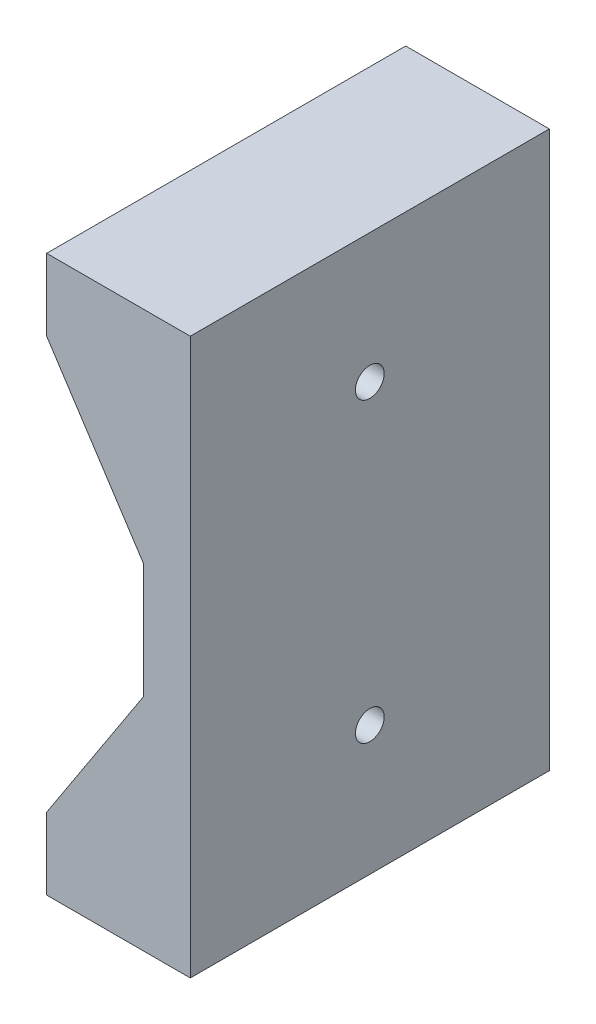
ISO-10303-21;
HEADER;
FILE_DESCRIPTION(('STEP AP214'),'2;1');
FILE_NAME('part.step','',(''),(''),'','','');
FILE_SCHEMA(('AUTOMOTIVE_DESIGN { 1 0 10303 214 1 1 1 1 }'));
ENDSEC;
DATA;
#1=APPLICATION_CONTEXT('core data for automotive mechanical design processes');
#2=APPLICATION_PROTOCOL_DEFINITION('international standard','automotive_design',2000,#1);
#3=PRODUCT_CONTEXT('',#1,'mechanical');
#4=PRODUCT('Part','Part','',(#3));
#5=PRODUCT_RELATED_PRODUCT_CATEGORY('part','',(#4));
#6=PRODUCT_DEFINITION_FORMATION('','',#4);
#7=PRODUCT_DEFINITION_CONTEXT('part definition',#1,'design');
#8=PRODUCT_DEFINITION('design','',#6,#7);
#9=PRODUCT_DEFINITION_SHAPE('','',#8);
#10=(LENGTH_UNIT() NAMED_UNIT(*) SI_UNIT(.MILLI.,.METRE.));
#11=(NAMED_UNIT(*) PLANE_ANGLE_UNIT() SI_UNIT($,.RADIAN.));
#12=(NAMED_UNIT(*) SI_UNIT($,.STERADIAN.) SOLID_ANGLE_UNIT());
#13=UNCERTAINTY_MEASURE_WITH_UNIT(LENGTH_MEASURE(1.E-05),#10,'distance_accuracy_value','');
#14=(GEOMETRIC_REPRESENTATION_CONTEXT(3) GLOBAL_UNCERTAINTY_ASSIGNED_CONTEXT((#13)) GLOBAL_UNIT_ASSIGNED_CONTEXT((#10,
#11,#12)) REPRESENTATION_CONTEXT('',''));
#15=CARTESIAN_POINT('',(0.,0.,0.));
#16=DIRECTION('',(0.,0.,1.));
#17=DIRECTION('',(1.,0.,0.));
#18=AXIS2_PLACEMENT_3D('',#15,#16,#17);
#19=CARTESIAN_POINT('',(8.5,0.,0.));
#20=DIRECTION('',(1.,0.,0.));
#21=DIRECTION('',(0.,0.,-1.));
#22=AXIS2_PLACEMENT_3D('',#19,#20,#21);
#23=PLANE('',#22);
#24=DIRECTION('',(0.,0.,-1.));
#25=VECTOR('',#24,1.);
#26=CARTESIAN_POINT('',(8.5,8.,0.));
#27=LINE('',#26,#25);
#28=CARTESIAN_POINT('',(8.5,8.,80.1107059078754));
#29=VERTEX_POINT('',#28);
#30=CARTESIAN_POINT('',(8.5,8.,70.1107059078754));
#31=VERTEX_POINT('',#30);
#32=EDGE_CURVE('E376',#29,#31,#27,.T.);
#33=ORIENTED_EDGE('',*,*,#32,.T.);
#34=DIRECTION('',(0.,1.,0.));
#35=VECTOR('',#34,1.);
#36=CARTESIAN_POINT('',(8.5,8.,70.1107059078754));
#37=LINE('',#36,#35);
#38=CARTESIAN_POINT('',(8.5,-8.,70.1107059078754));
#39=VERTEX_POINT('',#38);
#40=EDGE_CURVE('E194',#39,#31,#37,.T.);
#41=ORIENTED_EDGE('',*,*,#40,.F.);
#42=CARTESIAN_POINT('',(8.5,-8.,70.1107059078754));
#43=DIRECTION('',(0.,0.,1.));
#44=VECTOR('',#43,1.);
#45=LINE('',#42,#44);
#46=CARTESIAN_POINT('',(8.5,-8.,80.1107059078754));
#47=VERTEX_POINT('',#46);
#48=EDGE_CURVE('E186',#39,#47,#45,.T.);
#49=ORIENTED_EDGE('',*,*,#48,.T.);
#50=DIRECTION('',(0.,1.,0.));
#51=VECTOR('',#50,1.);
#52=CARTESIAN_POINT('',(8.5,8.,80.1107059078754));
#53=LINE('',#52,#51);
#54=EDGE_CURVE('E176',#47,#29,#53,.T.);
#55=ORIENTED_EDGE('',*,*,#54,.T.);
#56=EDGE_LOOP('',(#33,#41,#49,#55));
#57=FACE_BOUND('',#56,.T.);
#58=ADVANCED_FACE('F71',(#57),#23,.F.);
#59=CARTESIAN_POINT('',(12.,0.,0.));
#60=DIRECTION('',(1.,0.,0.));
#61=DIRECTION('',(0.,0.,-1.));
#62=AXIS2_PLACEMENT_3D('',#59,#60,#61);
#63=PLANE('',#62);
#64=CARTESIAN_POINT('',(12.,-20.7,55.1107059078754));
#65=DIRECTION('',(1.,0.,0.));
#66=DIRECTION('',(0.,0.,1.));
#67=AXIS2_PLACEMENT_3D('',#64,#65,#66);
#68=CIRCLE('',#67,2.);
#69=CARTESIAN_POINT('',(12.,-20.7,57.1107059078754));
#70=VERTEX_POINT('',#69);
#71=EDGE_CURVE('E322',#70,#70,#68,.T.);
#72=ORIENTED_EDGE('',*,*,#71,.T.);
#73=EDGE_LOOP('',(#72));
#74=FACE_BOUND('',#73,.T.);
#75=CARTESIAN_POINT('',(12.,-20.7,55.1107059078754));
#76=DIRECTION('',(-1.,0.,0.));
#77=DIRECTION('',(0.,0.,-1.));
#78=AXIS2_PLACEMENT_3D('',#75,#76,#77);
#79=CIRCLE('',#78,15.);
#80=CARTESIAN_POINT('',(12.,-28.7,42.4221283674258));
#81=VERTEX_POINT('',#80);
#82=CARTESIAN_POINT('',(12.,-28.7,67.7992834483249));
#83=VERTEX_POINT('',#82);
#84=EDGE_CURVE('E148',#81,#83,#79,.T.);
#85=ORIENTED_EDGE('',*,*,#84,.T.);
#86=DIRECTION('',(0.,0.993823396653931,0.110973223181287));
#87=VECTOR('',#86,1.);
#88=CARTESIAN_POINT('',(12.,-28.7,67.7992834483249));
#89=LINE('',#88,#87);
#90=CARTESIAN_POINT('',(12.,-8.,70.1107059078754));
#91=VERTEX_POINT('',#90);
#92=EDGE_CURVE('E134',#83,#91,#89,.T.);
#93=ORIENTED_EDGE('',*,*,#92,.T.);
#94=DIRECTION('',(0.,1.,0.));
#95=VECTOR('',#94,1.);
#96=CARTESIAN_POINT('',(12.,8.,70.1107059078754));
#97=LINE('',#96,#95);
#98=CARTESIAN_POINT('',(12.,8.,70.1107059078754));
#99=VERTEX_POINT('',#98);
#100=EDGE_CURVE('E388',#91,#99,#97,.T.);
#101=ORIENTED_EDGE('',*,*,#100,.T.);
#102=DIRECTION('',(0.,0.993823396653931,-0.110973223181287));
#103=VECTOR('',#102,1.);
#104=CARTESIAN_POINT('',(12.,8.,70.1107059078754));
#105=LINE('',#104,#103);
#106=CARTESIAN_POINT('',(12.,28.7,67.7992834483249));
#107=VERTEX_POINT('',#106);
#108=EDGE_CURVE('E914',#99,#107,#105,.T.);
#109=ORIENTED_EDGE('',*,*,#108,.T.);
#110=CARTESIAN_POINT('',(12.,20.7,55.1107059078754));
#111=DIRECTION('',(1.,0.,0.));
#112=DIRECTION('',(0.,0.,-1.));
#113=AXIS2_PLACEMENT_3D('',#110,#111,#112);
#114=CIRCLE('',#113,15.);
#115=CARTESIAN_POINT('',(12.,28.7,42.4221283674258));
#116=VERTEX_POINT('',#115);
#117=EDGE_CURVE('E314',#116,#107,#114,.T.);
#118=ORIENTED_EDGE('',*,*,#117,.F.);
#119=DIRECTION('',(0.,-0.993823396653931,-0.110973223181286));
#120=VECTOR('',#119,1.);
#121=CARTESIAN_POINT('',(12.,28.7,42.4221283674258));
#122=LINE('',#121,#120);
#123=CARTESIAN_POINT('',(12.,8.,40.1107059078754));
#124=VERTEX_POINT('',#123);
#125=EDGE_CURVE('E945',#116,#124,#122,.T.);
#126=ORIENTED_EDGE('',*,*,#125,.T.);
#127=DIRECTION('',(0.,-1.,0.));
#128=VECTOR('',#127,1.);
#129=CARTESIAN_POINT('',(12.,8.,40.1107059078754));
#130=LINE('',#129,#128);
#131=CARTESIAN_POINT('',(12.,-8.,40.1107059078754));
#132=VERTEX_POINT('',#131);
#133=EDGE_CURVE('E280',#124,#132,#130,.T.);
#134=ORIENTED_EDGE('',*,*,#133,.T.);
#135=DIRECTION('',(0.,-0.993823396653931,0.110973223181286));
#136=VECTOR('',#135,1.);
#137=CARTESIAN_POINT('',(12.,-8.,40.1107059078754));
#138=LINE('',#137,#136);
#139=EDGE_CURVE('E158',#132,#81,#138,.T.);
#140=ORIENTED_EDGE('',*,*,#139,.T.);
#141=EDGE_LOOP('',(#85,#93,#101,#109,#118,#126,#134,#140));
#142=FACE_BOUND('',#141,.T.);
#143=CARTESIAN_POINT('',(12.,20.7,55.1107059078754));
#144=DIRECTION('',(1.,0.,0.));
#145=DIRECTION('',(0.,0.,-1.));
#146=AXIS2_PLACEMENT_3D('',#143,#144,#145);
#147=CIRCLE('',#146,2.);
#148=CARTESIAN_POINT('',(12.,20.7,53.1107059078754));
#149=VERTEX_POINT('',#148);
#150=EDGE_CURVE('E333',#149,#149,#147,.T.);
#151=ORIENTED_EDGE('',*,*,#150,.T.);
#152=EDGE_LOOP('',(#151));
#153=FACE_BOUND('',#152,.T.);
#154=ADVANCED_FACE('F154',(#74,#142,#153),#63,.F.);
#155=CARTESIAN_POINT('',(12.,38.7,80.1107059078754));
#156=DIRECTION('',(0.,0.,1.));
#157=DIRECTION('',(0.,-1.,0.));
#158=AXIS2_PLACEMENT_3D('',#155,#156,#157);
#159=PLANE('',#158);
#160=DIRECTION('',(0.,-1.,0.));
#161=VECTOR('',#160,1.);
#162=CARTESIAN_POINT('',(15.,38.7,80.1107059078754));
#163=LINE('',#162,#161);
#164=CARTESIAN_POINT('',(15.,38.7,80.1107059078754));
#165=VERTEX_POINT('',#164);
#166=CARTESIAN_POINT('',(15.,-38.7,80.1107059078753));
#167=VERTEX_POINT('',#166);
#168=EDGE_CURVE('E332',#165,#167,#163,.T.);
#169=ORIENTED_EDGE('',*,*,#168,.F.);
#170=DIRECTION('',(1.,0.,0.));
#171=VECTOR('',#170,1.);
#172=CARTESIAN_POINT('',(12.,38.7,80.1107059078754));
#173=LINE('',#172,#171);
#174=CARTESIAN_POINT('',(-5.,38.7,80.1107059078754));
#175=VERTEX_POINT('',#174);
#176=EDGE_CURVE('E346',#175,#165,#173,.T.);
#177=ORIENTED_EDGE('',*,*,#176,.F.);
#178=DIRECTION('',(0.,1.,0.));
#179=VECTOR('',#178,1.);
#180=CARTESIAN_POINT('',(-5.,38.7,80.1107059078754));
#181=LINE('',#180,#179);
#182=CARTESIAN_POINT('',(-5.,28.7,80.1107059078754));
#183=VERTEX_POINT('',#182);
#184=EDGE_CURVE('E325',#183,#175,#181,.T.);
#185=ORIENTED_EDGE('',*,*,#184,.F.);
#186=DIRECTION('',(-0.546267780546922,0.837610596838614,0.));
#187=VECTOR('',#186,1.);
#188=CARTESIAN_POINT('',(8.5,8.,80.1107059078754));
#189=LINE('',#188,#187);
#190=EDGE_CURVE('E907',#29,#183,#189,.T.);
#191=ORIENTED_EDGE('',*,*,#190,.F.);
#192=ORIENTED_EDGE('',*,*,#54,.F.);
#193=DIRECTION('',(0.546267780546922,0.837610596838614,0.));
#194=VECTOR('',#193,1.);
#195=CARTESIAN_POINT('',(-5.,-28.7,80.1107059078754));
#196=LINE('',#195,#194);
#197=CARTESIAN_POINT('',(-5.,-28.7,80.1107059078754));
#198=VERTEX_POINT('',#197);
#199=EDGE_CURVE('E902',#198,#47,#196,.T.);
#200=ORIENTED_EDGE('',*,*,#199,.F.);
#201=DIRECTION('',(0.,-1.,0.));
#202=VECTOR('',#201,1.);
#203=CARTESIAN_POINT('',(-5.,-38.7,80.1107059078754));
#204=LINE('',#203,#202);
#205=CARTESIAN_POINT('',(-5.,-38.7,80.1107059078754));
#206=VERTEX_POINT('',#205);
#207=EDGE_CURVE('E173',#198,#206,#204,.T.);
#208=ORIENTED_EDGE('',*,*,#207,.T.);
#209=DIRECTION('',(1.,0.,0.));
#210=VECTOR('',#209,1.);
#211=CARTESIAN_POINT('',(12.,-38.7,80.1107059078753));
#212=LINE('',#211,#210);
#213=EDGE_CURVE('E349',#206,#167,#212,.T.);
#214=ORIENTED_EDGE('',*,*,#213,.T.);
#215=EDGE_LOOP('',(#169,#177,#185,#191,#192,#200,#208,#214));
#216=FACE_BOUND('',#215,.T.);
#217=ADVANCED_FACE('F74',(#216),#159,.T.);
#218=CARTESIAN_POINT('',(12.,38.7,80.1107059078754));
#219=DIRECTION('',(0.,1.,0.));
#220=DIRECTION('',(0.,0.,1.));
#221=AXIS2_PLACEMENT_3D('',#218,#219,#220);
#222=PLANE('',#221);
#223=DIRECTION('',(0.,0.,1.));
#224=VECTOR('',#223,1.);
#225=CARTESIAN_POINT('',(15.,38.7,80.1107059078754));
#226=LINE('',#225,#224);
#227=CARTESIAN_POINT('',(15.,38.7,30.1107059078754));
#228=VERTEX_POINT('',#227);
#229=EDGE_CURVE('E344',#228,#165,#226,.T.);
#230=ORIENTED_EDGE('',*,*,#229,.F.);
#231=DIRECTION('',(1.,0.,0.));
#232=VECTOR('',#231,1.);
#233=CARTESIAN_POINT('',(12.,38.7,30.1107059078754));
#234=LINE('',#233,#232);
#235=CARTESIAN_POINT('',(-5.,38.7,30.1107059078754));
#236=VERTEX_POINT('',#235);
#237=EDGE_CURVE('E351',#236,#228,#234,.T.);
#238=ORIENTED_EDGE('',*,*,#237,.F.);
#239=DIRECTION('',(0.,0.,-1.));
#240=VECTOR('',#239,1.);
#241=CARTESIAN_POINT('',(-5.,38.7,30.1107059078754));
#242=LINE('',#241,#240);
#243=EDGE_CURVE('E319',#175,#236,#242,.T.);
#244=ORIENTED_EDGE('',*,*,#243,.F.);
#245=ORIENTED_EDGE('',*,*,#176,.T.);
#246=EDGE_LOOP('',(#230,#238,#244,#245));
#247=FACE_BOUND('',#246,.T.);
#248=ADVANCED_FACE('F442',(#247),#222,.T.);
#249=CARTESIAN_POINT('',(12.,38.7,30.1107059078754));
#250=DIRECTION('',(0.,0.,-1.));
#251=DIRECTION('',(0.,1.,0.));
#252=AXIS2_PLACEMENT_3D('',#249,#250,#251);
#253=PLANE('',#252);
#254=DIRECTION('',(0.,1.,0.));
#255=VECTOR('',#254,1.);
#256=CARTESIAN_POINT('',(15.,38.7,30.1107059078754));
#257=LINE('',#256,#255);
#258=CARTESIAN_POINT('',(15.,-38.7,30.1107059078754));
#259=VERTEX_POINT('',#258);
#260=EDGE_CURVE('E345',#259,#228,#257,.T.);
#261=ORIENTED_EDGE('',*,*,#260,.F.);
#262=DIRECTION('',(1.,0.,0.));
#263=VECTOR('',#262,1.);
#264=CARTESIAN_POINT('',(12.,-38.7,30.1107059078754));
#265=LINE('',#264,#263);
#266=CARTESIAN_POINT('',(-5.,-38.7,30.1107059078754));
#267=VERTEX_POINT('',#266);
#268=EDGE_CURVE('E358',#267,#259,#265,.T.);
#269=ORIENTED_EDGE('',*,*,#268,.F.);
#270=DIRECTION('',(0.,1.,0.));
#271=VECTOR('',#270,1.);
#272=CARTESIAN_POINT('',(-5.,-38.7,30.1107059078754));
#273=LINE('',#272,#271);
#274=CARTESIAN_POINT('',(-5.,-28.7,30.1107059078754));
#275=VERTEX_POINT('',#274);
#276=EDGE_CURVE('E160',#267,#275,#273,.T.);
#277=ORIENTED_EDGE('',*,*,#276,.T.);
#278=DIRECTION('',(-0.546267780546922,-0.837610596838614,0.));
#279=VECTOR('',#278,1.);
#280=CARTESIAN_POINT('',(8.5,-8.,30.1107059078754));
#281=LINE('',#280,#279);
#282=CARTESIAN_POINT('',(8.5,-8.,30.1107059078754));
#283=VERTEX_POINT('',#282);
#284=EDGE_CURVE('E898',#283,#275,#281,.T.);
#285=ORIENTED_EDGE('',*,*,#284,.F.);
#286=DIRECTION('',(0.,-1.,0.));
#287=VECTOR('',#286,1.);
#288=CARTESIAN_POINT('',(8.5,8.,30.1107059078754));
#289=LINE('',#288,#287);
#290=CARTESIAN_POINT('',(8.5,8.,30.1107059078754));
#291=VERTEX_POINT('',#290);
#292=EDGE_CURVE('E372',#291,#283,#289,.T.);
#293=ORIENTED_EDGE('',*,*,#292,.F.);
#294=DIRECTION('',(0.546267780546922,-0.837610596838614,0.));
#295=VECTOR('',#294,1.);
#296=CARTESIAN_POINT('',(-5.,28.7,30.1107059078754));
#297=LINE('',#296,#295);
#298=CARTESIAN_POINT('',(-5.,28.7,30.1107059078754));
#299=VERTEX_POINT('',#298);
#300=EDGE_CURVE('E229',#299,#291,#297,.T.);
#301=ORIENTED_EDGE('',*,*,#300,.F.);
#302=DIRECTION('',(0.,-1.,0.));
#303=VECTOR('',#302,1.);
#304=CARTESIAN_POINT('',(-5.,38.7,30.1107059078754));
#305=LINE('',#304,#303);
#306=EDGE_CURVE('E371',#236,#299,#305,.T.);
#307=ORIENTED_EDGE('',*,*,#306,.F.);
#308=ORIENTED_EDGE('',*,*,#237,.T.);
#309=EDGE_LOOP('',(#261,#269,#277,#285,#293,#301,#307,#308));
#310=FACE_BOUND('',#309,.T.);
#311=ADVANCED_FACE('F455',(#310),#253,.T.);
#312=CARTESIAN_POINT('',(12.,-38.7,80.1107059078753));
#313=DIRECTION('',(0.,-1.,0.));
#314=DIRECTION('',(0.,0.,-1.));
#315=AXIS2_PLACEMENT_3D('',#312,#313,#314);
#316=PLANE('',#315);
#317=DIRECTION('',(0.,0.,-1.));
#318=VECTOR('',#317,1.);
#319=CARTESIAN_POINT('',(15.,-38.7,80.1107059078753));
#320=LINE('',#319,#318);
#321=EDGE_CURVE('E339',#167,#259,#320,.T.);
#322=ORIENTED_EDGE('',*,*,#321,.F.);
#323=ORIENTED_EDGE('',*,*,#213,.F.);
#324=DIRECTION('',(0.,0.,-1.));
#325=VECTOR('',#324,1.);
#326=CARTESIAN_POINT('',(-5.,-38.7,30.1107059078754));
#327=LINE('',#326,#325);
#328=EDGE_CURVE('E163',#206,#267,#327,.T.);
#329=ORIENTED_EDGE('',*,*,#328,.T.);
#330=ORIENTED_EDGE('',*,*,#268,.T.);
#331=EDGE_LOOP('',(#322,#323,#329,#330));
#332=FACE_BOUND('',#331,.T.);
#333=ADVANCED_FACE('F510',(#332),#316,.T.);
#334=CARTESIAN_POINT('',(15.,0.,0.));
#335=DIRECTION('',(1.,0.,0.));
#336=DIRECTION('',(0.,0.,-1.));
#337=AXIS2_PLACEMENT_3D('',#334,#335,#336);
#338=PLANE('',#337);
#339=CARTESIAN_POINT('',(15.,-20.7,55.1107059078754));
#340=DIRECTION('',(1.,0.,0.));
#341=DIRECTION('',(0.,0.,1.));
#342=AXIS2_PLACEMENT_3D('',#339,#340,#341);
#343=CIRCLE('',#342,2.);
#344=CARTESIAN_POINT('',(15.,-20.7,57.1107059078754));
#345=VERTEX_POINT('',#344);
#346=EDGE_CURVE('E330',#345,#345,#343,.T.);
#347=ORIENTED_EDGE('',*,*,#346,.F.);
#348=EDGE_LOOP('',(#347));
#349=FACE_BOUND('',#348,.T.);
#350=CARTESIAN_POINT('',(15.,20.7,55.1107059078754));
#351=DIRECTION('',(1.,0.,0.));
#352=DIRECTION('',(0.,0.,-1.));
#353=AXIS2_PLACEMENT_3D('',#350,#351,#352);
#354=CIRCLE('',#353,2.);
#355=CARTESIAN_POINT('',(15.,20.7,53.1107059078754));
#356=VERTEX_POINT('',#355);
#357=EDGE_CURVE('E327',#356,#356,#354,.T.);
#358=ORIENTED_EDGE('',*,*,#357,.F.);
#359=EDGE_LOOP('',(#358));
#360=FACE_BOUND('',#359,.T.);
#361=ORIENTED_EDGE('',*,*,#168,.T.);
#362=ORIENTED_EDGE('',*,*,#321,.T.);
#363=ORIENTED_EDGE('',*,*,#260,.T.);
#364=ORIENTED_EDGE('',*,*,#229,.T.);
#365=EDGE_LOOP('',(#361,#362,#363,#364));
#366=FACE_BOUND('',#365,.T.);
#367=ADVANCED_FACE('F446',(#349,#360,#366),#338,.T.);
#368=CARTESIAN_POINT('',(12.,20.7,55.1107059078754));
#369=DIRECTION('',(1.,0.,0.));
#370=DIRECTION('',(0.,0.,-1.));
#371=AXIS2_PLACEMENT_3D('',#368,#369,#370);
#372=CYLINDRICAL_SURFACE('',#371,2.);
#373=ORIENTED_EDGE('',*,*,#150,.F.);
#374=EDGE_LOOP('',(#373));
#375=FACE_BOUND('',#374,.T.);
#376=ORIENTED_EDGE('',*,*,#357,.T.);
#377=EDGE_LOOP('',(#376));
#378=FACE_BOUND('',#377,.T.);
#379=ADVANCED_FACE('F496',(#375,#378),#372,.F.);
#380=CARTESIAN_POINT('',(12.,-20.7,55.1107059078754));
#381=DIRECTION('',(1.,0.,0.));
#382=DIRECTION('',(0.,0.,-1.));
#383=AXIS2_PLACEMENT_3D('',#380,#381,#382);
#384=CYLINDRICAL_SURFACE('',#383,2.);
#385=ORIENTED_EDGE('',*,*,#71,.F.);
#386=EDGE_LOOP('',(#385));
#387=FACE_BOUND('',#386,.T.);
#388=ORIENTED_EDGE('',*,*,#346,.T.);
#389=EDGE_LOOP('',(#388));
#390=FACE_BOUND('',#389,.T.);
#391=ADVANCED_FACE('F487',(#387,#390),#384,.F.);
#392=CARTESIAN_POINT('',(-5.,20.7,55.1107059078754));
#393=DIRECTION('',(1.,0.,0.));
#394=DIRECTION('',(0.,0.,-1.));
#395=AXIS2_PLACEMENT_3D('',#392,#393,#394);
#396=PLANE('',#395);
#397=ORIENTED_EDGE('',*,*,#306,.T.);
#398=DIRECTION('',(0.,0.,-1.));
#399=VECTOR('',#398,1.);
#400=CARTESIAN_POINT('',(-5.,28.7,55.1107059078754));
#401=LINE('',#400,#399);
#402=CARTESIAN_POINT('',(-5.,28.7,42.4221283674258));
#403=VERTEX_POINT('',#402);
#404=EDGE_CURVE('E243',#299,#403,#401,.F.);
#405=ORIENTED_EDGE('',*,*,#404,.T.);
#406=CARTESIAN_POINT('',(-5.,20.7,55.1107059078754));
#407=DIRECTION('',(1.,0.,0.));
#408=DIRECTION('',(0.,0.,-1.));
#409=AXIS2_PLACEMENT_3D('',#406,#407,#408);
#410=CIRCLE('',#409,15.);
#411=CARTESIAN_POINT('',(-5.,28.7,67.7992834483249));
#412=VERTEX_POINT('',#411);
#413=EDGE_CURVE('E467',#403,#412,#410,.T.);
#414=ORIENTED_EDGE('',*,*,#413,.T.);
#415=CARTESIAN_POINT('',(-5.,28.7,67.7992834483249));
#416=DIRECTION('',(0.,0.,1.));
#417=VECTOR('',#416,1.);
#418=LINE('',#415,#417);
#419=EDGE_CURVE('E465',#412,#183,#418,.T.);
#420=ORIENTED_EDGE('',*,*,#419,.T.);
#421=ORIENTED_EDGE('',*,*,#184,.T.);
#422=ORIENTED_EDGE('',*,*,#243,.T.);
#423=EDGE_LOOP('',(#397,#405,#414,#420,#421,#422));
#424=FACE_BOUND('',#423,.T.);
#425=CARTESIAN_POINT('',(-5.,33.7,34.1107059078754));
#426=DIRECTION('',(-1.,0.,0.));
#427=DIRECTION('',(0.,0.,1.));
#428=AXIS2_PLACEMENT_3D('',#425,#426,#427);
#429=CIRCLE('',#428,1.75);
#430=CARTESIAN_POINT('',(-5.,33.7,35.8607059078754));
#431=VERTEX_POINT('',#430);
#432=EDGE_CURVE('E315',#431,#431,#429,.T.);
#433=ORIENTED_EDGE('',*,*,#432,.F.);
#434=EDGE_LOOP('',(#433));
#435=FACE_BOUND('',#434,.T.);
#436=CARTESIAN_POINT('',(-5.,33.7,41.1107059078754));
#437=DIRECTION('',(-1.,0.,0.));
#438=DIRECTION('',(0.,0.,1.));
#439=AXIS2_PLACEMENT_3D('',#436,#437,#438);
#440=CIRCLE('',#439,1.75);
#441=CARTESIAN_POINT('',(-5.,33.7,42.8607059078754));
#442=VERTEX_POINT('',#441);
#443=EDGE_CURVE('E306',#442,#442,#440,.T.);
#444=ORIENTED_EDGE('',*,*,#443,.F.);
#445=EDGE_LOOP('',(#444));
#446=FACE_BOUND('',#445,.T.);
#447=CARTESIAN_POINT('',(-5.,33.7,69.1107059078754));
#448=DIRECTION('',(-1.,0.,0.));
#449=DIRECTION('',(0.,0.,1.));
#450=AXIS2_PLACEMENT_3D('',#447,#448,#449);
#451=CIRCLE('',#450,1.75);
#452=CARTESIAN_POINT('',(-5.,33.7,70.8607059078754));
#453=VERTEX_POINT('',#452);
#454=EDGE_CURVE('E297',#453,#453,#451,.T.);
#455=ORIENTED_EDGE('',*,*,#454,.F.);
#456=EDGE_LOOP('',(#455));
#457=FACE_BOUND('',#456,.T.);
#458=CARTESIAN_POINT('',(-5.,33.7,76.1107059078754));
#459=DIRECTION('',(-1.,0.,0.));
#460=DIRECTION('',(0.,0.,1.));
#461=AXIS2_PLACEMENT_3D('',#458,#459,#460);
#462=CIRCLE('',#461,1.75);
#463=CARTESIAN_POINT('',(-5.,33.7,77.8607059078754));
#464=VERTEX_POINT('',#463);
#465=EDGE_CURVE('E295',#464,#464,#462,.T.);
#466=ORIENTED_EDGE('',*,*,#465,.F.);
#467=EDGE_LOOP('',(#466));
#468=FACE_BOUND('',#467,.T.);
#469=ADVANCED_FACE('F460',(#424,#435,#446,#457,#468),#396,.F.);
#470=CARTESIAN_POINT('',(-5.,20.7,55.1107059078754));
#471=DIRECTION('',(1.,0.,0.));
#472=DIRECTION('',(0.,0.,-1.));
#473=AXIS2_PLACEMENT_3D('',#470,#471,#472);
#474=CYLINDRICAL_SURFACE('',#473,15.);
#475=ORIENTED_EDGE('',*,*,#117,.T.);
#476=CARTESIAN_POINT('',(-5.,28.7,67.7992834483249));
#477=DIRECTION('',(1.,0.,0.));
#478=VECTOR('',#477,1.);
#479=LINE('',#476,#478);
#480=EDGE_CURVE('E321',#412,#107,#479,.T.);
#481=ORIENTED_EDGE('',*,*,#480,.F.);
#482=ORIENTED_EDGE('',*,*,#413,.F.);
#483=DIRECTION('',(1.,0.,0.));
#484=VECTOR('',#483,1.);
#485=CARTESIAN_POINT('',(-5.,28.7,42.4221283674258));
#486=LINE('',#485,#484);
#487=EDGE_CURVE('E328',#403,#116,#486,.T.);
#488=ORIENTED_EDGE('',*,*,#487,.T.);
#489=EDGE_LOOP('',(#475,#481,#482,#488));
#490=FACE_BOUND('',#489,.T.);
#491=ADVANCED_FACE('F488',(#490),#474,.F.);
#492=CARTESIAN_POINT('',(-5.,33.7,34.1107059078754));
#493=DIRECTION('',(1.,0.,0.));
#494=DIRECTION('',(0.,0.,-1.));
#495=AXIS2_PLACEMENT_3D('',#492,#493,#494);
#496=CYLINDRICAL_SURFACE('',#495,1.75);
#497=ORIENTED_EDGE('',*,*,#432,.T.);
#498=EDGE_LOOP('',(#497));
#499=FACE_BOUND('',#498,.T.);
#500=CARTESIAN_POINT('',(12.,33.7,34.1107059078754));
#501=DIRECTION('',(-1.,0.,0.));
#502=DIRECTION('',(0.,0.,1.));
#503=AXIS2_PLACEMENT_3D('',#500,#501,#502);
#504=CIRCLE('',#503,1.75);
#505=CARTESIAN_POINT('',(12.,33.7,35.8607059078754));
#506=VERTEX_POINT('',#505);
#507=EDGE_CURVE('E307',#506,#506,#504,.T.);
#508=ORIENTED_EDGE('',*,*,#507,.F.);
#509=EDGE_LOOP('',(#508));
#510=FACE_BOUND('',#509,.T.);
#511=ADVANCED_FACE('F486',(#499,#510),#496,.F.);
#512=CARTESIAN_POINT('',(-5.,33.7,41.1107059078754));
#513=DIRECTION('',(1.,0.,0.));
#514=DIRECTION('',(0.,0.,-1.));
#515=AXIS2_PLACEMENT_3D('',#512,#513,#514);
#516=CYLINDRICAL_SURFACE('',#515,1.75);
#517=ORIENTED_EDGE('',*,*,#443,.T.);
#518=EDGE_LOOP('',(#517));
#519=FACE_BOUND('',#518,.T.);
#520=CARTESIAN_POINT('',(12.,33.7,41.1107059078754));
#521=DIRECTION('',(-1.,0.,0.));
#522=DIRECTION('',(0.,0.,1.));
#523=AXIS2_PLACEMENT_3D('',#520,#521,#522);
#524=CIRCLE('',#523,1.75);
#525=CARTESIAN_POINT('',(12.,33.7,42.8607059078754));
#526=VERTEX_POINT('',#525);
#527=EDGE_CURVE('E303',#526,#526,#524,.T.);
#528=ORIENTED_EDGE('',*,*,#527,.F.);
#529=EDGE_LOOP('',(#528));
#530=FACE_BOUND('',#529,.T.);
#531=ADVANCED_FACE('F739',(#519,#530),#516,.F.);
#532=CARTESIAN_POINT('',(-5.,33.7,69.1107059078754));
#533=DIRECTION('',(1.,0.,0.));
#534=DIRECTION('',(0.,0.,-1.));
#535=AXIS2_PLACEMENT_3D('',#532,#533,#534);
#536=CYLINDRICAL_SURFACE('',#535,1.75);
#537=ORIENTED_EDGE('',*,*,#454,.T.);
#538=EDGE_LOOP('',(#537));
#539=FACE_BOUND('',#538,.T.);
#540=CARTESIAN_POINT('',(12.,33.7,69.1107059078754));
#541=DIRECTION('',(-1.,0.,0.));
#542=DIRECTION('',(0.,0.,1.));
#543=AXIS2_PLACEMENT_3D('',#540,#541,#542);
#544=CIRCLE('',#543,1.75);
#545=CARTESIAN_POINT('',(12.,33.7,70.8607059078754));
#546=VERTEX_POINT('',#545);
#547=EDGE_CURVE('E300',#546,#546,#544,.T.);
#548=ORIENTED_EDGE('',*,*,#547,.F.);
#549=EDGE_LOOP('',(#548));
#550=FACE_BOUND('',#549,.T.);
#551=ADVANCED_FACE('F729',(#539,#550),#536,.F.);
#552=CARTESIAN_POINT('',(-5.,33.7,76.1107059078754));
#553=DIRECTION('',(1.,0.,0.));
#554=DIRECTION('',(0.,0.,-1.));
#555=AXIS2_PLACEMENT_3D('',#552,#553,#554);
#556=CYLINDRICAL_SURFACE('',#555,1.75);
#557=ORIENTED_EDGE('',*,*,#465,.T.);
#558=EDGE_LOOP('',(#557));
#559=FACE_BOUND('',#558,.T.);
#560=CARTESIAN_POINT('',(12.,33.7,76.1107059078754));
#561=DIRECTION('',(-1.,0.,0.));
#562=DIRECTION('',(0.,0.,1.));
#563=AXIS2_PLACEMENT_3D('',#560,#561,#562);
#564=CIRCLE('',#563,1.75);
#565=CARTESIAN_POINT('',(12.,33.7,77.8607059078754));
#566=VERTEX_POINT('',#565);
#567=EDGE_CURVE('E155',#566,#566,#564,.T.);
#568=ORIENTED_EDGE('',*,*,#567,.F.);
#569=EDGE_LOOP('',(#568));
#570=FACE_BOUND('',#569,.T.);
#571=ADVANCED_FACE('F722',(#559,#570),#556,.F.);
#572=ORIENTED_EDGE('',*,*,#527,.T.);
#573=EDGE_LOOP('',(#572));
#574=FACE_BOUND('',#573,.T.);
#575=ADVANCED_FACE('F726',(#574),#63,.F.);
#576=ORIENTED_EDGE('',*,*,#507,.T.);
#577=EDGE_LOOP('',(#576));
#578=FACE_BOUND('',#577,.T.);
#579=ADVANCED_FACE('F775',(#578),#63,.F.);
#580=ORIENTED_EDGE('',*,*,#547,.T.);
#581=EDGE_LOOP('',(#580));
#582=FACE_BOUND('',#581,.T.);
#583=ADVANCED_FACE('F716',(#582),#63,.F.);
#584=ORIENTED_EDGE('',*,*,#567,.T.);
#585=EDGE_LOOP('',(#584));
#586=FACE_BOUND('',#585,.T.);
#587=ADVANCED_FACE('F502',(#586),#63,.F.);
#588=CARTESIAN_POINT('',(-5.,-20.7,55.1107059078754));
#589=DIRECTION('',(1.,0.,0.));
#590=DIRECTION('',(0.,0.,-1.));
#591=AXIS2_PLACEMENT_3D('',#588,#589,#590);
#592=CYLINDRICAL_SURFACE('',#591,15.);
#593=ORIENTED_EDGE('',*,*,#84,.F.);
#594=DIRECTION('',(1.,0.,0.));
#595=VECTOR('',#594,1.);
#596=CARTESIAN_POINT('',(-5.,-28.7,42.4221283674258));
#597=LINE('',#596,#595);
#598=CARTESIAN_POINT('',(-5.,-28.7,42.4221283674258));
#599=VERTEX_POINT('',#598);
#600=EDGE_CURVE('E95',#599,#81,#597,.T.);
#601=ORIENTED_EDGE('',*,*,#600,.F.);
#602=CARTESIAN_POINT('',(-5.,-20.7,55.1107059078754));
#603=DIRECTION('',(-1.,0.,0.));
#604=DIRECTION('',(0.,0.,-1.));
#605=AXIS2_PLACEMENT_3D('',#602,#603,#604);
#606=CIRCLE('',#605,15.);
#607=CARTESIAN_POINT('',(-5.,-28.7,67.7992834483249));
#608=VERTEX_POINT('',#607);
#609=EDGE_CURVE('E152',#599,#608,#606,.T.);
#610=ORIENTED_EDGE('',*,*,#609,.T.);
#611=DIRECTION('',(1.,0.,0.));
#612=VECTOR('',#611,1.);
#613=CARTESIAN_POINT('',(-5.,-28.7,67.7992834483249));
#614=LINE('',#613,#612);
#615=EDGE_CURVE('E80',#608,#83,#614,.T.);
#616=ORIENTED_EDGE('',*,*,#615,.T.);
#617=EDGE_LOOP('',(#593,#601,#610,#616));
#618=FACE_BOUND('',#617,.T.);
#619=ADVANCED_FACE('F147',(#618),#592,.F.);
#620=CARTESIAN_POINT('',(-5.,-20.7,55.1107059078754));
#621=DIRECTION('',(1.,0.,0.));
#622=DIRECTION('',(0.,0.,-1.));
#623=AXIS2_PLACEMENT_3D('',#620,#621,#622);
#624=PLANE('',#623);
#625=CARTESIAN_POINT('',(-5.,-33.7,76.1107059078754));
#626=DIRECTION('',(1.,0.,0.));
#627=DIRECTION('',(0.,0.,1.));
#628=AXIS2_PLACEMENT_3D('',#625,#626,#627);
#629=CIRCLE('',#628,1.75);
#630=CARTESIAN_POINT('',(-5.,-33.7,77.8607059078754));
#631=VERTEX_POINT('',#630);
#632=EDGE_CURVE('E282',#631,#631,#629,.T.);
#633=ORIENTED_EDGE('',*,*,#632,.T.);
#634=EDGE_LOOP('',(#633));
#635=FACE_BOUND('',#634,.T.);
#636=CARTESIAN_POINT('',(-5.,-33.7,69.1107059078754));
#637=DIRECTION('',(1.,0.,0.));
#638=DIRECTION('',(0.,0.,1.));
#639=AXIS2_PLACEMENT_3D('',#636,#637,#638);
#640=CIRCLE('',#639,1.75);
#641=CARTESIAN_POINT('',(-5.,-33.7,70.8607059078754));
#642=VERTEX_POINT('',#641);
#643=EDGE_CURVE('E281',#642,#642,#640,.T.);
#644=ORIENTED_EDGE('',*,*,#643,.T.);
#645=EDGE_LOOP('',(#644));
#646=FACE_BOUND('',#645,.T.);
#647=CARTESIAN_POINT('',(-5.,-33.7,41.1107059078754));
#648=DIRECTION('',(1.,0.,0.));
#649=DIRECTION('',(0.,0.,1.));
#650=AXIS2_PLACEMENT_3D('',#647,#648,#649);
#651=CIRCLE('',#650,1.75);
#652=CARTESIAN_POINT('',(-5.,-33.7,42.8607059078754));
#653=VERTEX_POINT('',#652);
#654=EDGE_CURVE('E165',#653,#653,#651,.T.);
#655=ORIENTED_EDGE('',*,*,#654,.T.);
#656=EDGE_LOOP('',(#655));
#657=FACE_BOUND('',#656,.T.);
#658=CARTESIAN_POINT('',(-5.,-33.7,34.1107059078754));
#659=DIRECTION('',(1.,0.,0.));
#660=DIRECTION('',(0.,0.,1.));
#661=AXIS2_PLACEMENT_3D('',#658,#659,#660);
#662=CIRCLE('',#661,1.75);
#663=CARTESIAN_POINT('',(-5.,-33.7,35.8607059078754));
#664=VERTEX_POINT('',#663);
#665=EDGE_CURVE('E156',#664,#664,#662,.T.);
#666=ORIENTED_EDGE('',*,*,#665,.T.);
#667=EDGE_LOOP('',(#666));
#668=FACE_BOUND('',#667,.T.);
#669=ORIENTED_EDGE('',*,*,#276,.F.);
#670=ORIENTED_EDGE('',*,*,#328,.F.);
#671=ORIENTED_EDGE('',*,*,#207,.F.);
#672=DIRECTION('',(0.,0.,1.));
#673=VECTOR('',#672,1.);
#674=CARTESIAN_POINT('',(-5.,-28.7,0.));
#675=LINE('',#674,#673);
#676=EDGE_CURVE('E175',#608,#198,#675,.T.);
#677=ORIENTED_EDGE('',*,*,#676,.F.);
#678=ORIENTED_EDGE('',*,*,#609,.F.);
#679=DIRECTION('',(0.,0.,1.));
#680=VECTOR('',#679,1.);
#681=CARTESIAN_POINT('',(-5.,-28.7,30.1107059078754));
#682=LINE('',#681,#680);
#683=EDGE_CURVE('E171',#275,#599,#682,.T.);
#684=ORIENTED_EDGE('',*,*,#683,.F.);
#685=EDGE_LOOP('',(#669,#670,#671,#677,#678,#684));
#686=FACE_BOUND('',#685,.T.);
#687=ADVANCED_FACE('F550',(#635,#646,#657,#668,#686),#624,.F.);
#688=CARTESIAN_POINT('',(-5.,-33.7,34.1107059078754));
#689=DIRECTION('',(1.,0.,0.));
#690=DIRECTION('',(0.,0.,-1.));
#691=AXIS2_PLACEMENT_3D('',#688,#689,#690);
#692=CYLINDRICAL_SURFACE('',#691,1.75);
#693=ORIENTED_EDGE('',*,*,#665,.F.);
#694=EDGE_LOOP('',(#693));
#695=FACE_BOUND('',#694,.T.);
#696=CARTESIAN_POINT('',(12.,-33.7,34.1107059078754));
#697=DIRECTION('',(1.,0.,0.));
#698=DIRECTION('',(0.,0.,-1.));
#699=AXIS2_PLACEMENT_3D('',#696,#697,#698);
#700=CIRCLE('',#699,1.75);
#701=CARTESIAN_POINT('',(12.,-33.7,32.3607059078754));
#702=VERTEX_POINT('',#701);
#703=EDGE_CURVE('E12',#702,#702,#700,.T.);
#704=ORIENTED_EDGE('',*,*,#703,.T.);
#705=EDGE_LOOP('',(#704));
#706=FACE_BOUND('',#705,.T.);
#707=ADVANCED_FACE('F554',(#695,#706),#692,.F.);
#708=CARTESIAN_POINT('',(-5.,-33.7,41.1107059078754));
#709=DIRECTION('',(1.,0.,0.));
#710=DIRECTION('',(0.,0.,-1.));
#711=AXIS2_PLACEMENT_3D('',#708,#709,#710);
#712=CYLINDRICAL_SURFACE('',#711,1.75);
#713=ORIENTED_EDGE('',*,*,#654,.F.);
#714=EDGE_LOOP('',(#713));
#715=FACE_BOUND('',#714,.T.);
#716=CARTESIAN_POINT('',(12.,-33.7,41.1107059078754));
#717=DIRECTION('',(1.,0.,0.));
#718=DIRECTION('',(0.,0.,-1.));
#719=AXIS2_PLACEMENT_3D('',#716,#717,#718);
#720=CIRCLE('',#719,1.75);
#721=CARTESIAN_POINT('',(12.,-33.7,39.3607059078754));
#722=VERTEX_POINT('',#721);
#723=EDGE_CURVE('E82',#722,#722,#720,.T.);
#724=ORIENTED_EDGE('',*,*,#723,.T.);
#725=EDGE_LOOP('',(#724));
#726=FACE_BOUND('',#725,.T.);
#727=ADVANCED_FACE('F670',(#715,#726),#712,.F.);
#728=CARTESIAN_POINT('',(-5.,-33.7,69.1107059078754));
#729=DIRECTION('',(1.,0.,0.));
#730=DIRECTION('',(0.,0.,-1.));
#731=AXIS2_PLACEMENT_3D('',#728,#729,#730);
#732=CYLINDRICAL_SURFACE('',#731,1.75);
#733=ORIENTED_EDGE('',*,*,#643,.F.);
#734=EDGE_LOOP('',(#733));
#735=FACE_BOUND('',#734,.T.);
#736=CARTESIAN_POINT('',(12.,-33.7,69.1107059078754));
#737=DIRECTION('',(1.,0.,0.));
#738=DIRECTION('',(0.,0.,-1.));
#739=AXIS2_PLACEMENT_3D('',#736,#737,#738);
#740=CIRCLE('',#739,1.75);
#741=CARTESIAN_POINT('',(12.,-33.7,67.3607059078754));
#742=VERTEX_POINT('',#741);
#743=EDGE_CURVE('E361',#742,#742,#740,.T.);
#744=ORIENTED_EDGE('',*,*,#743,.T.);
#745=EDGE_LOOP('',(#744));
#746=FACE_BOUND('',#745,.T.);
#747=ADVANCED_FACE('F657',(#735,#746),#732,.F.);
#748=CARTESIAN_POINT('',(-5.,-33.7,76.1107059078754));
#749=DIRECTION('',(1.,0.,0.));
#750=DIRECTION('',(0.,0.,-1.));
#751=AXIS2_PLACEMENT_3D('',#748,#749,#750);
#752=CYLINDRICAL_SURFACE('',#751,1.75);
#753=ORIENTED_EDGE('',*,*,#632,.F.);
#754=EDGE_LOOP('',(#753));
#755=FACE_BOUND('',#754,.T.);
#756=CARTESIAN_POINT('',(12.,-33.7,76.1107059078754));
#757=DIRECTION('',(1.,0.,0.));
#758=DIRECTION('',(0.,0.,-1.));
#759=AXIS2_PLACEMENT_3D('',#756,#757,#758);
#760=CIRCLE('',#759,1.75);
#761=CARTESIAN_POINT('',(12.,-33.7,74.3607059078754));
#762=VERTEX_POINT('',#761);
#763=EDGE_CURVE('E355',#762,#762,#760,.T.);
#764=ORIENTED_EDGE('',*,*,#763,.T.);
#765=EDGE_LOOP('',(#764));
#766=FACE_BOUND('',#765,.T.);
#767=ADVANCED_FACE('F215',(#755,#766),#752,.F.);
#768=ORIENTED_EDGE('',*,*,#763,.F.);
#769=EDGE_LOOP('',(#768));
#770=FACE_BOUND('',#769,.T.);
#771=ADVANCED_FACE('F656',(#770),#63,.F.);
#772=ORIENTED_EDGE('',*,*,#743,.F.);
#773=EDGE_LOOP('',(#772));
#774=FACE_BOUND('',#773,.T.);
#775=ADVANCED_FACE('F701',(#774),#63,.F.);
#776=ORIENTED_EDGE('',*,*,#723,.F.);
#777=EDGE_LOOP('',(#776));
#778=FACE_BOUND('',#777,.T.);
#779=ADVANCED_FACE('F691',(#778),#63,.F.);
#780=ORIENTED_EDGE('',*,*,#703,.F.);
#781=EDGE_LOOP('',(#780));
#782=FACE_BOUND('',#781,.T.);
#783=ADVANCED_FACE('F206',(#782),#63,.F.);
#784=DIRECTION('',(0.,0.,1.));
#785=VECTOR('',#784,1.);
#786=CARTESIAN_POINT('',(8.5,-8.,80.1107059078754));
#787=LINE('',#786,#785);
#788=CARTESIAN_POINT('',(8.5,-8.,40.1107059078754));
#789=VERTEX_POINT('',#788);
#790=EDGE_CURVE('E277',#283,#789,#787,.T.);
#791=ORIENTED_EDGE('',*,*,#790,.T.);
#792=DIRECTION('',(0.,-1.,0.));
#793=VECTOR('',#792,1.);
#794=CARTESIAN_POINT('',(8.5,8.,40.1107059078754));
#795=LINE('',#794,#793);
#796=CARTESIAN_POINT('',(8.5,8.,40.1107059078754));
#797=VERTEX_POINT('',#796);
#798=EDGE_CURVE('E225',#797,#789,#795,.T.);
#799=ORIENTED_EDGE('',*,*,#798,.F.);
#800=CARTESIAN_POINT('',(8.5,8.,40.1107059078754));
#801=DIRECTION('',(0.,0.,-1.));
#802=VECTOR('',#801,1.);
#803=LINE('',#800,#802);
#804=EDGE_CURVE('E177',#797,#291,#803,.T.);
#805=ORIENTED_EDGE('',*,*,#804,.T.);
#806=ORIENTED_EDGE('',*,*,#292,.T.);
#807=EDGE_LOOP('',(#791,#799,#805,#806));
#808=FACE_BOUND('',#807,.T.);
#809=ADVANCED_FACE('F200',(#808),#23,.F.);
#810=CARTESIAN_POINT('',(46.,8.,70.1107059078754));
#811=DIRECTION('',(0.,0.,1.));
#812=DIRECTION('',(1.,0.,0.));
#813=AXIS2_PLACEMENT_3D('',#810,#811,#812);
#814=PLANE('',#813);
#815=CARTESIAN_POINT('',(12.,-8.,70.1107059078754));
#816=DIRECTION('',(-1.,0.,0.));
#817=VECTOR('',#816,1.);
#818=LINE('',#815,#817);
#819=EDGE_CURVE('E140',#91,#39,#818,.T.);
#820=ORIENTED_EDGE('',*,*,#819,.T.);
#821=ORIENTED_EDGE('',*,*,#40,.T.);
#822=DIRECTION('',(1.,0.,0.));
#823=VECTOR('',#822,1.);
#824=CARTESIAN_POINT('',(0.,8.,70.1107059078754));
#825=LINE('',#824,#823);
#826=EDGE_CURVE('E387',#99,#31,#825,.F.);
#827=ORIENTED_EDGE('',*,*,#826,.F.);
#828=ORIENTED_EDGE('',*,*,#100,.F.);
#829=EDGE_LOOP('',(#820,#821,#827,#828));
#830=FACE_BOUND('',#829,.T.);
#831=ADVANCED_FACE('F210',(#830),#814,.F.);
#832=CARTESIAN_POINT('',(46.,8.,40.1107059078754));
#833=DIRECTION('',(0.,0.,-1.));
#834=DIRECTION('',(-1.,0.,0.));
#835=AXIS2_PLACEMENT_3D('',#832,#833,#834);
#836=PLANE('',#835);
#837=CARTESIAN_POINT('',(12.,8.,40.1107059078754));
#838=DIRECTION('',(-1.,0.,0.));
#839=VECTOR('',#838,1.);
#840=LINE('',#837,#839);
#841=EDGE_CURVE('E238',#124,#797,#840,.T.);
#842=ORIENTED_EDGE('',*,*,#841,.T.);
#843=ORIENTED_EDGE('',*,*,#798,.T.);
#844=DIRECTION('',(-1.,0.,0.));
#845=VECTOR('',#844,1.);
#846=CARTESIAN_POINT('',(46.,-8.,40.1107059078754));
#847=LINE('',#846,#845);
#848=EDGE_CURVE('E179',#132,#789,#847,.T.);
#849=ORIENTED_EDGE('',*,*,#848,.F.);
#850=ORIENTED_EDGE('',*,*,#133,.F.);
#851=EDGE_LOOP('',(#842,#843,#849,#850));
#852=FACE_BOUND('',#851,.T.);
#853=ADVANCED_FACE('F244',(#852),#836,.F.);
#854=CARTESIAN_POINT('',(0.,-4.32520048331286,38.7344380230642));
#855=DIRECTION('',(0.,0.110973223181286,-0.993823396653931));
#856=DIRECTION('',(0.,0.993823396653931,0.110973223181286));
#857=AXIS2_PLACEMENT_3D('',#854,#855,#856);
#858=PLANE('',#857);
#859=DIRECTION('',(0.543894003746246,-0.833970805744244,-0.0931236159906592));
#860=VECTOR('',#859,1.);
#861=CARTESIAN_POINT('',(-5.,28.7,42.4221283674258));
#862=LINE('',#861,#860);
#863=EDGE_CURVE('E913',#403,#797,#862,.T.);
#864=ORIENTED_EDGE('',*,*,#863,.T.);
#865=ORIENTED_EDGE('',*,*,#841,.F.);
#866=ORIENTED_EDGE('',*,*,#125,.F.);
#867=ORIENTED_EDGE('',*,*,#487,.F.);
#868=EDGE_LOOP('',(#864,#865,#866,#867));
#869=FACE_BOUND('',#868,.T.);
#870=ADVANCED_FACE('F251',(#869),#858,.F.);
#871=CARTESIAN_POINT('',(9.62400530503979,6.27652519893899,0.));
#872=DIRECTION('',(0.837610596838614,0.546267780546922,0.));
#873=DIRECTION('',(-0.546267780546922,0.837610596838614,0.));
#874=AXIS2_PLACEMENT_3D('',#871,#872,#873);
#875=PLANE('',#874);
#876=ORIENTED_EDGE('',*,*,#300,.T.);
#877=ORIENTED_EDGE('',*,*,#804,.F.);
#878=ORIENTED_EDGE('',*,*,#863,.F.);
#879=ORIENTED_EDGE('',*,*,#404,.F.);
#880=EDGE_LOOP('',(#876,#877,#878,#879));
#881=FACE_BOUND('',#880,.T.);
#882=ADVANCED_FACE('F253',(#881),#875,.F.);
#883=CARTESIAN_POINT('',(9.62400530503979,6.27652519893899,0.));
#884=DIRECTION('',(0.837610596838614,0.546267780546922,0.));
#885=DIRECTION('',(-0.546267780546922,0.837610596838614,0.));
#886=AXIS2_PLACEMENT_3D('',#883,#884,#885);
#887=PLANE('',#886);
#888=ORIENTED_EDGE('',*,*,#190,.T.);
#889=ORIENTED_EDGE('',*,*,#419,.F.);
#890=DIRECTION('',(-0.543894003746246,0.833970805744244,-0.0931236159906594));
#891=VECTOR('',#890,1.);
#892=CARTESIAN_POINT('',(8.5,8.,70.1107059078754));
#893=LINE('',#892,#891);
#894=EDGE_CURVE('E909',#31,#412,#893,.T.);
#895=ORIENTED_EDGE('',*,*,#894,.F.);
#896=ORIENTED_EDGE('',*,*,#32,.F.);
#897=EDGE_LOOP('',(#888,#889,#895,#896));
#898=FACE_BOUND('',#897,.T.);
#899=ADVANCED_FACE('F258',(#898),#887,.F.);
#900=CARTESIAN_POINT('',(0.,7.8308749515146,70.1295909047615));
#901=DIRECTION('',(0.,-0.110973223181287,-0.993823396653931));
#902=DIRECTION('',(0.,0.993823396653931,-0.110973223181287));
#903=AXIS2_PLACEMENT_3D('',#900,#901,#902);
#904=PLANE('',#903);
#905=ORIENTED_EDGE('',*,*,#894,.T.);
#906=ORIENTED_EDGE('',*,*,#480,.T.);
#907=ORIENTED_EDGE('',*,*,#108,.F.);
#908=ORIENTED_EDGE('',*,*,#826,.T.);
#909=EDGE_LOOP('',(#905,#906,#907,#908));
#910=FACE_BOUND('',#909,.T.);
#911=ADVANCED_FACE('F595',(#910),#904,.T.);
#912=CARTESIAN_POINT('',(9.62400530503979,-6.27652519893899,0.));
#913=DIRECTION('',(-0.837610596838614,0.546267780546922,0.));
#914=DIRECTION('',(-0.546267780546922,-0.837610596838614,0.));
#915=AXIS2_PLACEMENT_3D('',#912,#913,#914);
#916=PLANE('',#915);
#917=ORIENTED_EDGE('',*,*,#284,.T.);
#918=ORIENTED_EDGE('',*,*,#683,.T.);
#919=DIRECTION('',(-0.543894003746246,-0.833970805744244,0.0931236159906592));
#920=VECTOR('',#919,1.);
#921=CARTESIAN_POINT('',(8.5,-8.,40.1107059078754));
#922=LINE('',#921,#920);
#923=EDGE_CURVE('E899',#789,#599,#922,.T.);
#924=ORIENTED_EDGE('',*,*,#923,.F.);
#925=ORIENTED_EDGE('',*,*,#790,.F.);
#926=EDGE_LOOP('',(#917,#918,#924,#925));
#927=FACE_BOUND('',#926,.T.);
#928=ADVANCED_FACE('F584',(#927),#916,.T.);
#929=CARTESIAN_POINT('',(0.,4.32520048331286,38.7344380230642));
#930=DIRECTION('',(0.,0.110973223181286,0.993823396653931));
#931=DIRECTION('',(0.,-0.993823396653931,0.110973223181286));
#932=AXIS2_PLACEMENT_3D('',#929,#930,#931);
#933=PLANE('',#932);
#934=ORIENTED_EDGE('',*,*,#923,.T.);
#935=ORIENTED_EDGE('',*,*,#600,.T.);
#936=ORIENTED_EDGE('',*,*,#139,.F.);
#937=ORIENTED_EDGE('',*,*,#848,.T.);
#938=EDGE_LOOP('',(#934,#935,#936,#937));
#939=FACE_BOUND('',#938,.T.);
#940=ADVANCED_FACE('F528',(#939),#933,.T.);
#941=CARTESIAN_POINT('',(0.,-7.8308749515146,70.1295909047615));
#942=DIRECTION('',(0.,-0.110973223181287,0.993823396653931));
#943=DIRECTION('',(0.,-0.993823396653931,-0.110973223181287));
#944=AXIS2_PLACEMENT_3D('',#941,#942,#943);
#945=PLANE('',#944);
#946=DIRECTION('',(0.543894003746246,0.833970805744244,0.0931236159906594));
#947=VECTOR('',#946,1.);
#948=CARTESIAN_POINT('',(-5.,-28.7,67.7992834483249));
#949=LINE('',#948,#947);
#950=EDGE_CURVE('E141',#608,#39,#949,.T.);
#951=ORIENTED_EDGE('',*,*,#950,.T.);
#952=ORIENTED_EDGE('',*,*,#819,.F.);
#953=ORIENTED_EDGE('',*,*,#92,.F.);
#954=ORIENTED_EDGE('',*,*,#615,.F.);
#955=EDGE_LOOP('',(#951,#952,#953,#954));
#956=FACE_BOUND('',#955,.T.);
#957=ADVANCED_FACE('F131',(#956),#945,.F.);
#958=CARTESIAN_POINT('',(9.62400530503979,-6.27652519893899,0.));
#959=DIRECTION('',(0.837610596838614,-0.546267780546922,0.));
#960=DIRECTION('',(0.546267780546922,0.837610596838614,0.));
#961=AXIS2_PLACEMENT_3D('',#958,#959,#960);
#962=PLANE('',#961);
#963=ORIENTED_EDGE('',*,*,#199,.T.);
#964=ORIENTED_EDGE('',*,*,#48,.F.);
#965=ORIENTED_EDGE('',*,*,#950,.F.);
#966=ORIENTED_EDGE('',*,*,#676,.T.);
#967=EDGE_LOOP('',(#963,#964,#965,#966));
#968=FACE_BOUND('',#967,.T.);
#969=ADVANCED_FACE('F567',(#968),#962,.F.);
#970=CLOSED_SHELL('',(#58,#154,#217,#248,#311,#333,#367,#379,#391,#469,#491,#511,#531,#551,#571,
#575,#579,#583,#587,#619,#687,#707,#727,#747,#767,#771,#775,#779,#783,#809,#831,#853,#870,#882,
#899,#911,#928,#940,#957,#969));
#971=MANIFOLD_SOLID_BREP('B2',#970);
#972=ADVANCED_BREP_SHAPE_REPRESENTATION('',(#18,#971),#14);
#973=SHAPE_DEFINITION_REPRESENTATION(#9,#972);
ENDSEC;
END-ISO-10303-21;
